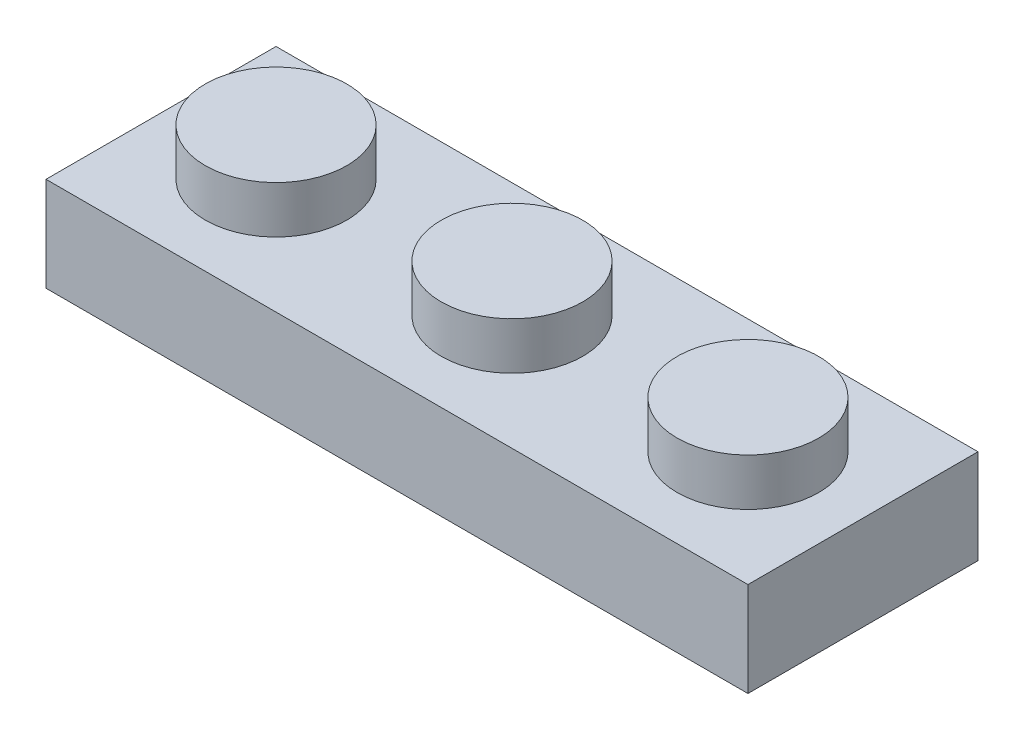
ISO-10303-21;
HEADER;
FILE_DESCRIPTION(('STEP AP214'),'2;1');
FILE_NAME('part.step','',(''),(''),'','','');
FILE_SCHEMA(('AUTOMOTIVE_DESIGN { 1 0 10303 214 1 1 1 1 }'));
ENDSEC;
DATA;
#1=APPLICATION_CONTEXT('core data for automotive mechanical design processes');
#2=APPLICATION_PROTOCOL_DEFINITION('international standard','automotive_design',2000,#1);
#3=PRODUCT_CONTEXT('',#1,'mechanical');
#4=PRODUCT('Part','Part','',(#3));
#5=PRODUCT_RELATED_PRODUCT_CATEGORY('part','',(#4));
#6=PRODUCT_DEFINITION_FORMATION('','',#4);
#7=PRODUCT_DEFINITION_CONTEXT('part definition',#1,'design');
#8=PRODUCT_DEFINITION('design','',#6,#7);
#9=PRODUCT_DEFINITION_SHAPE('','',#8);
#10=(LENGTH_UNIT() NAMED_UNIT(*) SI_UNIT(.MILLI.,.METRE.));
#11=(NAMED_UNIT(*) PLANE_ANGLE_UNIT() SI_UNIT($,.RADIAN.));
#12=(NAMED_UNIT(*) SI_UNIT($,.STERADIAN.) SOLID_ANGLE_UNIT());
#13=UNCERTAINTY_MEASURE_WITH_UNIT(LENGTH_MEASURE(1.E-05),#10,'distance_accuracy_value','');
#14=(GEOMETRIC_REPRESENTATION_CONTEXT(3) GLOBAL_UNCERTAINTY_ASSIGNED_CONTEXT((#13)) GLOBAL_UNIT_ASSIGNED_CONTEXT((#10,
#11,#12)) REPRESENTATION_CONTEXT('',''));
#15=CARTESIAN_POINT('',(0.,0.,0.));
#16=DIRECTION('',(0.,0.,1.));
#17=DIRECTION('',(1.,0.,0.));
#18=AXIS2_PLACEMENT_3D('',#15,#16,#17);
#19=CARTESIAN_POINT('',(0.,0.,-7.8));
#20=DIRECTION('',(0.,-1.,0.));
#21=DIRECTION('',(0.,0.,-1.));
#22=AXIS2_PLACEMENT_3D('',#19,#20,#21);
#23=PLANE('',#22);
#24=DIRECTION('',(1.,0.,0.));
#25=VECTOR('',#24,1.);
#26=CARTESIAN_POINT('',(0.,0.,0.));
#27=LINE('',#26,#25);
#28=CARTESIAN_POINT('',(0.,0.,0.));
#29=VERTEX_POINT('',#28);
#30=CARTESIAN_POINT('',(23.8,0.,0.));
#31=VERTEX_POINT('',#30);
#32=EDGE_CURVE('E213',#29,#31,#27,.T.);
#33=ORIENTED_EDGE('',*,*,#32,.F.);
#34=DIRECTION('',(0.,0.,1.));
#35=VECTOR('',#34,1.);
#36=CARTESIAN_POINT('',(0.,0.,-7.8));
#37=LINE('',#36,#35);
#38=CARTESIAN_POINT('',(0.,0.,-7.8));
#39=VERTEX_POINT('',#38);
#40=EDGE_CURVE('E92',#39,#29,#37,.T.);
#41=ORIENTED_EDGE('',*,*,#40,.F.);
#42=DIRECTION('',(1.,0.,0.));
#43=VECTOR('',#42,1.);
#44=CARTESIAN_POINT('',(0.,0.,-7.8));
#45=LINE('',#44,#43);
#46=CARTESIAN_POINT('',(23.8,0.,-7.8));
#47=VERTEX_POINT('',#46);
#48=EDGE_CURVE('E199',#39,#47,#45,.T.);
#49=ORIENTED_EDGE('',*,*,#48,.T.);
#50=DIRECTION('',(0.,0.,1.));
#51=VECTOR('',#50,1.);
#52=CARTESIAN_POINT('',(23.8,0.,-7.8));
#53=LINE('',#52,#51);
#54=EDGE_CURVE('E230',#47,#31,#53,.T.);
#55=ORIENTED_EDGE('',*,*,#54,.T.);
#56=EDGE_LOOP('',(#33,#41,#49,#55));
#57=FACE_BOUND('',#56,.T.);
#58=DIRECTION('',(0.,0.,1.));
#59=VECTOR('',#58,1.);
#60=CARTESIAN_POINT('',(1.2,0.,-7.8));
#61=LINE('',#60,#59);
#62=CARTESIAN_POINT('',(1.2,0.,-6.6));
#63=VERTEX_POINT('',#62);
#64=CARTESIAN_POINT('',(1.2,0.,-1.2));
#65=VERTEX_POINT('',#64);
#66=EDGE_CURVE('E140',#63,#65,#61,.T.);
#67=ORIENTED_EDGE('',*,*,#66,.T.);
#68=DIRECTION('',(1.,0.,0.));
#69=VECTOR('',#68,1.);
#70=CARTESIAN_POINT('',(0.,0.,-1.2));
#71=LINE('',#70,#69);
#72=CARTESIAN_POINT('',(22.6,0.,-1.2));
#73=VERTEX_POINT('',#72);
#74=EDGE_CURVE('E154',#65,#73,#71,.T.);
#75=ORIENTED_EDGE('',*,*,#74,.T.);
#76=DIRECTION('',(0.,0.,1.));
#77=VECTOR('',#76,1.);
#78=CARTESIAN_POINT('',(22.6,0.,-7.8));
#79=LINE('',#78,#77);
#80=CARTESIAN_POINT('',(22.6,0.,-6.6));
#81=VERTEX_POINT('',#80);
#82=EDGE_CURVE('E129',#81,#73,#79,.T.);
#83=ORIENTED_EDGE('',*,*,#82,.F.);
#84=DIRECTION('',(1.,0.,0.));
#85=VECTOR('',#84,1.);
#86=CARTESIAN_POINT('',(0.,0.,-6.6));
#87=LINE('',#86,#85);
#88=EDGE_CURVE('E57',#63,#81,#87,.T.);
#89=ORIENTED_EDGE('',*,*,#88,.F.);
#90=EDGE_LOOP('',(#67,#75,#83,#89));
#91=FACE_BOUND('',#90,.T.);
#92=ADVANCED_FACE('F41',(#57,#91),#23,.T.);
#93=CARTESIAN_POINT('',(19.9,4.8,-3.9));
#94=DIRECTION('',(0.,1.,0.));
#95=DIRECTION('',(0.,0.,1.));
#96=AXIS2_PLACEMENT_3D('',#93,#94,#95);
#97=PLANE('',#96);
#98=CARTESIAN_POINT('',(19.9,4.8,-3.9));
#99=DIRECTION('',(0.,1.,0.));
#100=DIRECTION('',(0.,0.,1.));
#101=AXIS2_PLACEMENT_3D('',#98,#99,#100);
#102=CIRCLE('',#101,2.4);
#103=CARTESIAN_POINT('',(19.9,4.8,-1.5));
#104=VERTEX_POINT('',#103);
#105=EDGE_CURVE('E238',#104,#104,#102,.T.);
#106=ORIENTED_EDGE('',*,*,#105,.T.);
#107=EDGE_LOOP('',(#106));
#108=FACE_BOUND('',#107,.T.);
#109=ADVANCED_FACE('F43',(#108),#97,.T.);
#110=CARTESIAN_POINT('',(19.9,4.8,-3.9));
#111=DIRECTION('',(0.,-1.,0.));
#112=DIRECTION('',(0.,0.,-1.));
#113=AXIS2_PLACEMENT_3D('',#110,#111,#112);
#114=CYLINDRICAL_SURFACE('',#113,2.4);
#115=ORIENTED_EDGE('',*,*,#105,.F.);
#116=EDGE_LOOP('',(#115));
#117=FACE_BOUND('',#116,.T.);
#118=CARTESIAN_POINT('',(19.9,3.2,-3.9));
#119=DIRECTION('',(0.,1.,0.));
#120=DIRECTION('',(0.,0.,1.));
#121=AXIS2_PLACEMENT_3D('',#118,#119,#120);
#122=CIRCLE('',#121,2.4);
#123=CARTESIAN_POINT('',(19.9,3.2,-1.5));
#124=VERTEX_POINT('',#123);
#125=EDGE_CURVE('E226',#124,#124,#122,.T.);
#126=ORIENTED_EDGE('',*,*,#125,.T.);
#127=EDGE_LOOP('',(#126));
#128=FACE_BOUND('',#127,.T.);
#129=ADVANCED_FACE('F276',(#117,#128),#114,.T.);
#130=CARTESIAN_POINT('',(0.,0.,-7.8));
#131=DIRECTION('',(-1.,0.,0.));
#132=DIRECTION('',(0.,0.,1.));
#133=AXIS2_PLACEMENT_3D('',#130,#131,#132);
#134=PLANE('',#133);
#135=DIRECTION('',(0.,-1.,0.));
#136=VECTOR('',#135,1.);
#137=CARTESIAN_POINT('',(0.,0.,0.));
#138=LINE('',#137,#136);
#139=CARTESIAN_POINT('',(0.,3.2,0.));
#140=VERTEX_POINT('',#139);
#141=EDGE_CURVE('E192',#140,#29,#138,.T.);
#142=ORIENTED_EDGE('',*,*,#141,.F.);
#143=DIRECTION('',(0.,0.,1.));
#144=VECTOR('',#143,1.);
#145=CARTESIAN_POINT('',(0.,3.2,-7.8));
#146=LINE('',#145,#144);
#147=CARTESIAN_POINT('',(0.,3.2,-7.8));
#148=VERTEX_POINT('',#147);
#149=EDGE_CURVE('E66',#148,#140,#146,.T.);
#150=ORIENTED_EDGE('',*,*,#149,.F.);
#151=DIRECTION('',(0.,-1.,0.));
#152=VECTOR('',#151,1.);
#153=CARTESIAN_POINT('',(0.,0.,-7.8));
#154=LINE('',#153,#152);
#155=EDGE_CURVE('E196',#148,#39,#154,.T.);
#156=ORIENTED_EDGE('',*,*,#155,.T.);
#157=ORIENTED_EDGE('',*,*,#40,.T.);
#158=EDGE_LOOP('',(#142,#150,#156,#157));
#159=FACE_BOUND('',#158,.T.);
#160=ADVANCED_FACE('F282',(#159),#134,.T.);
#161=CARTESIAN_POINT('',(0.,3.2,-7.8));
#162=DIRECTION('',(0.,1.,0.));
#163=DIRECTION('',(0.,0.,1.));
#164=AXIS2_PLACEMENT_3D('',#161,#162,#163);
#165=PLANE('',#164);
#166=CARTESIAN_POINT('',(11.9,3.2,-3.9));
#167=DIRECTION('',(0.,1.,0.));
#168=DIRECTION('',(0.,0.,1.));
#169=AXIS2_PLACEMENT_3D('',#166,#167,#168);
#170=CIRCLE('',#169,2.4);
#171=CARTESIAN_POINT('',(11.9,3.2,-1.5));
#172=VERTEX_POINT('',#171);
#173=EDGE_CURVE('E178',#172,#172,#170,.T.);
#174=ORIENTED_EDGE('',*,*,#173,.F.);
#175=EDGE_LOOP('',(#174));
#176=FACE_BOUND('',#175,.T.);
#177=CARTESIAN_POINT('',(3.9,3.2,-3.9));
#178=DIRECTION('',(0.,1.,0.));
#179=DIRECTION('',(0.,0.,1.));
#180=AXIS2_PLACEMENT_3D('',#177,#178,#179);
#181=CIRCLE('',#180,2.4);
#182=CARTESIAN_POINT('',(3.9,3.2,-1.5));
#183=VERTEX_POINT('',#182);
#184=EDGE_CURVE('E187',#183,#183,#181,.T.);
#185=ORIENTED_EDGE('',*,*,#184,.F.);
#186=EDGE_LOOP('',(#185));
#187=FACE_BOUND('',#186,.T.);
#188=DIRECTION('',(-1.,0.,0.));
#189=VECTOR('',#188,1.);
#190=CARTESIAN_POINT('',(0.,3.2,0.));
#191=LINE('',#190,#189);
#192=CARTESIAN_POINT('',(23.8,3.2,0.));
#193=VERTEX_POINT('',#192);
#194=EDGE_CURVE('E200',#193,#140,#191,.T.);
#195=ORIENTED_EDGE('',*,*,#194,.F.);
#196=DIRECTION('',(0.,0.,1.));
#197=VECTOR('',#196,1.);
#198=CARTESIAN_POINT('',(23.8,3.2,-7.8));
#199=LINE('',#198,#197);
#200=CARTESIAN_POINT('',(23.8,3.2,-7.8));
#201=VERTEX_POINT('',#200);
#202=EDGE_CURVE('E227',#201,#193,#199,.T.);
#203=ORIENTED_EDGE('',*,*,#202,.F.);
#204=DIRECTION('',(-1.,0.,0.));
#205=VECTOR('',#204,1.);
#206=CARTESIAN_POINT('',(0.,3.2,-7.8));
#207=LINE('',#206,#205);
#208=EDGE_CURVE('E207',#201,#148,#207,.T.);
#209=ORIENTED_EDGE('',*,*,#208,.T.);
#210=ORIENTED_EDGE('',*,*,#149,.T.);
#211=EDGE_LOOP('',(#195,#203,#209,#210));
#212=FACE_BOUND('',#211,.T.);
#213=ORIENTED_EDGE('',*,*,#125,.F.);
#214=EDGE_LOOP('',(#213));
#215=FACE_BOUND('',#214,.T.);
#216=ADVANCED_FACE('F284',(#176,#187,#212,#215),#165,.T.);
#217=CARTESIAN_POINT('',(23.8,0.,-7.8));
#218=DIRECTION('',(1.,0.,0.));
#219=DIRECTION('',(0.,0.,-1.));
#220=AXIS2_PLACEMENT_3D('',#217,#218,#219);
#221=PLANE('',#220);
#222=DIRECTION('',(0.,1.,0.));
#223=VECTOR('',#222,1.);
#224=CARTESIAN_POINT('',(23.8,0.,0.));
#225=LINE('',#224,#223);
#226=EDGE_CURVE('E217',#31,#193,#225,.T.);
#227=ORIENTED_EDGE('',*,*,#226,.F.);
#228=ORIENTED_EDGE('',*,*,#54,.F.);
#229=DIRECTION('',(0.,1.,0.));
#230=VECTOR('',#229,1.);
#231=CARTESIAN_POINT('',(23.8,0.,-7.8));
#232=LINE('',#231,#230);
#233=EDGE_CURVE('E203',#47,#201,#232,.T.);
#234=ORIENTED_EDGE('',*,*,#233,.T.);
#235=ORIENTED_EDGE('',*,*,#202,.T.);
#236=EDGE_LOOP('',(#227,#228,#234,#235));
#237=FACE_BOUND('',#236,.T.);
#238=ADVANCED_FACE('F280',(#237),#221,.T.);
#239=CARTESIAN_POINT('',(0.,0.,-7.8));
#240=DIRECTION('',(0.,0.,-1.));
#241=DIRECTION('',(-1.,0.,0.));
#242=AXIS2_PLACEMENT_3D('',#239,#240,#241);
#243=PLANE('',#242);
#244=ORIENTED_EDGE('',*,*,#155,.F.);
#245=ORIENTED_EDGE('',*,*,#208,.F.);
#246=ORIENTED_EDGE('',*,*,#233,.F.);
#247=ORIENTED_EDGE('',*,*,#48,.F.);
#248=EDGE_LOOP('',(#244,#245,#246,#247));
#249=FACE_BOUND('',#248,.T.);
#250=ADVANCED_FACE('F298',(#249),#243,.T.);
#251=CARTESIAN_POINT('',(0.,0.,0.));
#252=DIRECTION('',(0.,0.,-1.));
#253=DIRECTION('',(-1.,0.,0.));
#254=AXIS2_PLACEMENT_3D('',#251,#252,#253);
#255=PLANE('',#254);
#256=ORIENTED_EDGE('',*,*,#141,.T.);
#257=ORIENTED_EDGE('',*,*,#32,.T.);
#258=ORIENTED_EDGE('',*,*,#226,.T.);
#259=ORIENTED_EDGE('',*,*,#194,.T.);
#260=EDGE_LOOP('',(#256,#257,#258,#259));
#261=FACE_BOUND('',#260,.T.);
#262=ADVANCED_FACE('F303',(#261),#255,.F.);
#263=CARTESIAN_POINT('',(3.9,4.8,-3.9));
#264=DIRECTION('',(0.,-1.,0.));
#265=DIRECTION('',(0.,0.,-1.));
#266=AXIS2_PLACEMENT_3D('',#263,#264,#265);
#267=CYLINDRICAL_SURFACE('',#266,2.4);
#268=CARTESIAN_POINT('',(3.9,4.8,-3.9));
#269=DIRECTION('',(0.,1.,0.));
#270=DIRECTION('',(0.,0.,1.));
#271=AXIS2_PLACEMENT_3D('',#268,#269,#270);
#272=CIRCLE('',#271,2.4);
#273=CARTESIAN_POINT('',(3.9,4.8,-1.5));
#274=VERTEX_POINT('',#273);
#275=EDGE_CURVE('E188',#274,#274,#272,.T.);
#276=ORIENTED_EDGE('',*,*,#275,.F.);
#277=EDGE_LOOP('',(#276));
#278=FACE_BOUND('',#277,.T.);
#279=ORIENTED_EDGE('',*,*,#184,.T.);
#280=EDGE_LOOP('',(#279));
#281=FACE_BOUND('',#280,.T.);
#282=ADVANCED_FACE('F306',(#278,#281),#267,.T.);
#283=CARTESIAN_POINT('',(3.9,4.8,-3.9));
#284=DIRECTION('',(0.,1.,0.));
#285=DIRECTION('',(0.,0.,1.));
#286=AXIS2_PLACEMENT_3D('',#283,#284,#285);
#287=PLANE('',#286);
#288=ORIENTED_EDGE('',*,*,#275,.T.);
#289=EDGE_LOOP('',(#288));
#290=FACE_BOUND('',#289,.T.);
#291=ADVANCED_FACE('F313',(#290),#287,.T.);
#292=CARTESIAN_POINT('',(11.9,4.8,-3.9));
#293=DIRECTION('',(0.,-1.,0.));
#294=DIRECTION('',(0.,0.,-1.));
#295=AXIS2_PLACEMENT_3D('',#292,#293,#294);
#296=CYLINDRICAL_SURFACE('',#295,2.4);
#297=CARTESIAN_POINT('',(11.9,4.8,-3.9));
#298=DIRECTION('',(0.,1.,0.));
#299=DIRECTION('',(0.,0.,1.));
#300=AXIS2_PLACEMENT_3D('',#297,#298,#299);
#301=CIRCLE('',#300,2.4);
#302=CARTESIAN_POINT('',(11.9,4.8,-1.5));
#303=VERTEX_POINT('',#302);
#304=EDGE_CURVE('E182',#303,#303,#301,.T.);
#305=ORIENTED_EDGE('',*,*,#304,.F.);
#306=EDGE_LOOP('',(#305));
#307=FACE_BOUND('',#306,.T.);
#308=ORIENTED_EDGE('',*,*,#173,.T.);
#309=EDGE_LOOP('',(#308));
#310=FACE_BOUND('',#309,.T.);
#311=ADVANCED_FACE('F317',(#307,#310),#296,.T.);
#312=CARTESIAN_POINT('',(11.9,4.8,-3.9));
#313=DIRECTION('',(0.,1.,0.));
#314=DIRECTION('',(0.,0.,1.));
#315=AXIS2_PLACEMENT_3D('',#312,#313,#314);
#316=PLANE('',#315);
#317=ORIENTED_EDGE('',*,*,#304,.T.);
#318=EDGE_LOOP('',(#317));
#319=FACE_BOUND('',#318,.T.);
#320=ADVANCED_FACE('F321',(#319),#316,.T.);
#321=CARTESIAN_POINT('',(19.9,3.6,-3.9));
#322=DIRECTION('',(0.,1.,0.));
#323=DIRECTION('',(0.,0.,1.));
#324=AXIS2_PLACEMENT_3D('',#321,#322,#323);
#325=PLANE('',#324);
#326=CARTESIAN_POINT('',(19.9,3.6,-3.9));
#327=DIRECTION('',(0.,1.,0.));
#328=DIRECTION('',(0.,0.,1.));
#329=AXIS2_PLACEMENT_3D('',#326,#327,#328);
#330=CIRCLE('',#329,1.2);
#331=CARTESIAN_POINT('',(19.9,3.6,-2.7));
#332=VERTEX_POINT('',#331);
#333=EDGE_CURVE('E183',#332,#332,#330,.T.);
#334=ORIENTED_EDGE('',*,*,#333,.F.);
#335=EDGE_LOOP('',(#334));
#336=FACE_BOUND('',#335,.T.);
#337=ADVANCED_FACE('F325',(#336),#325,.F.);
#338=CARTESIAN_POINT('',(19.9,4.8,-3.9));
#339=DIRECTION('',(0.,-1.,0.));
#340=DIRECTION('',(0.,0.,-1.));
#341=AXIS2_PLACEMENT_3D('',#338,#339,#340);
#342=CYLINDRICAL_SURFACE('',#341,1.2);
#343=ORIENTED_EDGE('',*,*,#333,.T.);
#344=EDGE_LOOP('',(#343));
#345=FACE_BOUND('',#344,.T.);
#346=CARTESIAN_POINT('',(19.9,2.,-3.9));
#347=DIRECTION('',(0.,1.,0.));
#348=DIRECTION('',(0.,0.,1.));
#349=AXIS2_PLACEMENT_3D('',#346,#347,#348);
#350=CIRCLE('',#349,1.2);
#351=CARTESIAN_POINT('',(19.9,2.,-2.7));
#352=VERTEX_POINT('',#351);
#353=EDGE_CURVE('E149',#352,#352,#350,.T.);
#354=ORIENTED_EDGE('',*,*,#353,.F.);
#355=EDGE_LOOP('',(#354));
#356=FACE_BOUND('',#355,.T.);
#357=ADVANCED_FACE('F351',(#345,#356),#342,.F.);
#358=CARTESIAN_POINT('',(1.2,0.,-7.8));
#359=DIRECTION('',(-1.,0.,0.));
#360=DIRECTION('',(0.,0.,1.));
#361=AXIS2_PLACEMENT_3D('',#358,#359,#360);
#362=PLANE('',#361);
#363=DIRECTION('',(0.,-1.,0.));
#364=VECTOR('',#363,1.);
#365=CARTESIAN_POINT('',(1.2,0.,-1.2));
#366=LINE('',#365,#364);
#367=CARTESIAN_POINT('',(1.2,2.,-1.2));
#368=VERTEX_POINT('',#367);
#369=EDGE_CURVE('E150',#368,#65,#366,.T.);
#370=ORIENTED_EDGE('',*,*,#369,.T.);
#371=ORIENTED_EDGE('',*,*,#66,.F.);
#372=DIRECTION('',(0.,-1.,0.));
#373=VECTOR('',#372,1.);
#374=CARTESIAN_POINT('',(1.2,0.,-6.6));
#375=LINE('',#374,#373);
#376=CARTESIAN_POINT('',(1.2,2.,-6.6));
#377=VERTEX_POINT('',#376);
#378=EDGE_CURVE('E156',#377,#63,#375,.T.);
#379=ORIENTED_EDGE('',*,*,#378,.F.);
#380=DIRECTION('',(0.,0.,1.));
#381=VECTOR('',#380,1.);
#382=CARTESIAN_POINT('',(1.2,2.,-7.8));
#383=LINE('',#382,#381);
#384=EDGE_CURVE('E128',#377,#368,#383,.T.);
#385=ORIENTED_EDGE('',*,*,#384,.T.);
#386=EDGE_LOOP('',(#370,#371,#379,#385));
#387=FACE_BOUND('',#386,.T.);
#388=ADVANCED_FACE('F250',(#387),#362,.F.);
#389=CARTESIAN_POINT('',(0.,2.,-7.8));
#390=DIRECTION('',(0.,1.,0.));
#391=DIRECTION('',(0.,0.,1.));
#392=AXIS2_PLACEMENT_3D('',#389,#390,#391);
#393=PLANE('',#392);
#394=CARTESIAN_POINT('',(15.9,2.,-3.9));
#395=DIRECTION('',(0.,1.,0.));
#396=DIRECTION('',(0.,0.,1.));
#397=AXIS2_PLACEMENT_3D('',#394,#395,#396);
#398=CIRCLE('',#397,1.5);
#399=CARTESIAN_POINT('',(15.9,2.,-2.4));
#400=VERTEX_POINT('',#399);
#401=EDGE_CURVE('E12',#400,#400,#398,.F.);
#402=ORIENTED_EDGE('',*,*,#401,.F.);
#403=EDGE_LOOP('',(#402));
#404=FACE_BOUND('',#403,.T.);
#405=CARTESIAN_POINT('',(7.9,2.,-3.9));
#406=DIRECTION('',(0.,1.,0.));
#407=DIRECTION('',(0.,0.,1.));
#408=AXIS2_PLACEMENT_3D('',#405,#406,#407);
#409=CIRCLE('',#408,1.5);
#410=CARTESIAN_POINT('',(7.9,2.,-2.4));
#411=VERTEX_POINT('',#410);
#412=EDGE_CURVE('E50',#411,#411,#409,.F.);
#413=ORIENTED_EDGE('',*,*,#412,.F.);
#414=EDGE_LOOP('',(#413));
#415=FACE_BOUND('',#414,.T.);
#416=CARTESIAN_POINT('',(11.9,2.,-3.9));
#417=DIRECTION('',(0.,1.,0.));
#418=DIRECTION('',(0.,0.,1.));
#419=AXIS2_PLACEMENT_3D('',#416,#417,#418);
#420=CIRCLE('',#419,1.2);
#421=CARTESIAN_POINT('',(11.9,2.,-2.7));
#422=VERTEX_POINT('',#421);
#423=EDGE_CURVE('E169',#422,#422,#420,.T.);
#424=ORIENTED_EDGE('',*,*,#423,.T.);
#425=EDGE_LOOP('',(#424));
#426=FACE_BOUND('',#425,.T.);
#427=CARTESIAN_POINT('',(3.9,2.,-3.9));
#428=DIRECTION('',(0.,1.,0.));
#429=DIRECTION('',(0.,0.,1.));
#430=AXIS2_PLACEMENT_3D('',#427,#428,#429);
#431=CIRCLE('',#430,1.2);
#432=CARTESIAN_POINT('',(3.9,2.,-2.7));
#433=VERTEX_POINT('',#432);
#434=EDGE_CURVE('E165',#433,#433,#431,.T.);
#435=ORIENTED_EDGE('',*,*,#434,.T.);
#436=EDGE_LOOP('',(#435));
#437=FACE_BOUND('',#436,.T.);
#438=DIRECTION('',(-1.,0.,0.));
#439=VECTOR('',#438,1.);
#440=CARTESIAN_POINT('',(0.,2.,-1.2));
#441=LINE('',#440,#439);
#442=CARTESIAN_POINT('',(22.6,2.,-1.2));
#443=VERTEX_POINT('',#442);
#444=EDGE_CURVE('E158',#443,#368,#441,.T.);
#445=ORIENTED_EDGE('',*,*,#444,.T.);
#446=ORIENTED_EDGE('',*,*,#384,.F.);
#447=DIRECTION('',(-1.,0.,0.));
#448=VECTOR('',#447,1.);
#449=CARTESIAN_POINT('',(0.,2.,-6.6));
#450=LINE('',#449,#448);
#451=CARTESIAN_POINT('',(22.6,2.,-6.6));
#452=VERTEX_POINT('',#451);
#453=EDGE_CURVE('E133',#452,#377,#450,.T.);
#454=ORIENTED_EDGE('',*,*,#453,.F.);
#455=DIRECTION('',(0.,0.,1.));
#456=VECTOR('',#455,1.);
#457=CARTESIAN_POINT('',(22.6,2.,-7.8));
#458=LINE('',#457,#456);
#459=EDGE_CURVE('E117',#452,#443,#458,.T.);
#460=ORIENTED_EDGE('',*,*,#459,.T.);
#461=EDGE_LOOP('',(#445,#446,#454,#460));
#462=FACE_BOUND('',#461,.T.);
#463=ORIENTED_EDGE('',*,*,#353,.T.);
#464=EDGE_LOOP('',(#463));
#465=FACE_BOUND('',#464,.T.);
#466=ADVANCED_FACE('F136',(#404,#415,#426,#437,#462,#465),#393,.F.);
#467=CARTESIAN_POINT('',(22.6,0.,-7.8));
#468=DIRECTION('',(1.,0.,0.));
#469=DIRECTION('',(0.,0.,-1.));
#470=AXIS2_PLACEMENT_3D('',#467,#468,#469);
#471=PLANE('',#470);
#472=DIRECTION('',(0.,1.,0.));
#473=VECTOR('',#472,1.);
#474=CARTESIAN_POINT('',(22.6,0.,-1.2));
#475=LINE('',#474,#473);
#476=EDGE_CURVE('E122',#73,#443,#475,.T.);
#477=ORIENTED_EDGE('',*,*,#476,.T.);
#478=ORIENTED_EDGE('',*,*,#459,.F.);
#479=DIRECTION('',(0.,1.,0.));
#480=VECTOR('',#479,1.);
#481=CARTESIAN_POINT('',(22.6,0.,-6.6));
#482=LINE('',#481,#480);
#483=EDGE_CURVE('E119',#81,#452,#482,.T.);
#484=ORIENTED_EDGE('',*,*,#483,.F.);
#485=ORIENTED_EDGE('',*,*,#82,.T.);
#486=EDGE_LOOP('',(#477,#478,#484,#485));
#487=FACE_BOUND('',#486,.T.);
#488=ADVANCED_FACE('F118',(#487),#471,.F.);
#489=CARTESIAN_POINT('',(0.,0.,-6.6));
#490=DIRECTION('',(0.,0.,-1.));
#491=DIRECTION('',(-1.,0.,0.));
#492=AXIS2_PLACEMENT_3D('',#489,#490,#491);
#493=PLANE('',#492);
#494=ORIENTED_EDGE('',*,*,#378,.T.);
#495=ORIENTED_EDGE('',*,*,#88,.T.);
#496=ORIENTED_EDGE('',*,*,#483,.T.);
#497=ORIENTED_EDGE('',*,*,#453,.T.);
#498=EDGE_LOOP('',(#494,#495,#496,#497));
#499=FACE_BOUND('',#498,.T.);
#500=ADVANCED_FACE('F132',(#499),#493,.F.);
#501=CARTESIAN_POINT('',(0.,0.,-1.2));
#502=DIRECTION('',(0.,0.,-1.));
#503=DIRECTION('',(-1.,0.,0.));
#504=AXIS2_PLACEMENT_3D('',#501,#502,#503);
#505=PLANE('',#504);
#506=ORIENTED_EDGE('',*,*,#369,.F.);
#507=ORIENTED_EDGE('',*,*,#444,.F.);
#508=ORIENTED_EDGE('',*,*,#476,.F.);
#509=ORIENTED_EDGE('',*,*,#74,.F.);
#510=EDGE_LOOP('',(#506,#507,#508,#509));
#511=FACE_BOUND('',#510,.T.);
#512=ADVANCED_FACE('F268',(#511),#505,.T.);
#513=CARTESIAN_POINT('',(3.9,4.8,-3.9));
#514=DIRECTION('',(0.,-1.,0.));
#515=DIRECTION('',(0.,0.,-1.));
#516=AXIS2_PLACEMENT_3D('',#513,#514,#515);
#517=CYLINDRICAL_SURFACE('',#516,1.2);
#518=CARTESIAN_POINT('',(3.9,3.6,-3.9));
#519=DIRECTION('',(0.,1.,0.));
#520=DIRECTION('',(0.,0.,1.));
#521=AXIS2_PLACEMENT_3D('',#518,#519,#520);
#522=CIRCLE('',#521,1.2);
#523=CARTESIAN_POINT('',(3.9,3.6,-2.7));
#524=VERTEX_POINT('',#523);
#525=EDGE_CURVE('E155',#524,#524,#522,.T.);
#526=ORIENTED_EDGE('',*,*,#525,.T.);
#527=EDGE_LOOP('',(#526));
#528=FACE_BOUND('',#527,.T.);
#529=ORIENTED_EDGE('',*,*,#434,.F.);
#530=EDGE_LOOP('',(#529));
#531=FACE_BOUND('',#530,.T.);
#532=ADVANCED_FACE('F338',(#528,#531),#517,.F.);
#533=CARTESIAN_POINT('',(3.9,3.6,-3.9));
#534=DIRECTION('',(0.,1.,0.));
#535=DIRECTION('',(0.,0.,1.));
#536=AXIS2_PLACEMENT_3D('',#533,#534,#535);
#537=PLANE('',#536);
#538=ORIENTED_EDGE('',*,*,#525,.F.);
#539=EDGE_LOOP('',(#538));
#540=FACE_BOUND('',#539,.T.);
#541=ADVANCED_FACE('F334',(#540),#537,.F.);
#542=CARTESIAN_POINT('',(11.9,4.8,-3.9));
#543=DIRECTION('',(0.,-1.,0.));
#544=DIRECTION('',(0.,0.,-1.));
#545=AXIS2_PLACEMENT_3D('',#542,#543,#544);
#546=CYLINDRICAL_SURFACE('',#545,1.2);
#547=CARTESIAN_POINT('',(11.9,3.6,-3.9));
#548=DIRECTION('',(0.,1.,0.));
#549=DIRECTION('',(0.,0.,1.));
#550=AXIS2_PLACEMENT_3D('',#547,#548,#549);
#551=CIRCLE('',#550,1.2);
#552=CARTESIAN_POINT('',(11.9,3.6,-2.7));
#553=VERTEX_POINT('',#552);
#554=EDGE_CURVE('E166',#553,#553,#551,.T.);
#555=ORIENTED_EDGE('',*,*,#554,.T.);
#556=EDGE_LOOP('',(#555));
#557=FACE_BOUND('',#556,.T.);
#558=ORIENTED_EDGE('',*,*,#423,.F.);
#559=EDGE_LOOP('',(#558));
#560=FACE_BOUND('',#559,.T.);
#561=ADVANCED_FACE('F330',(#557,#560),#546,.F.);
#562=CARTESIAN_POINT('',(11.9,3.6,-3.9));
#563=DIRECTION('',(0.,1.,0.));
#564=DIRECTION('',(0.,0.,1.));
#565=AXIS2_PLACEMENT_3D('',#562,#563,#564);
#566=PLANE('',#565);
#567=ORIENTED_EDGE('',*,*,#554,.F.);
#568=EDGE_LOOP('',(#567));
#569=FACE_BOUND('',#568,.T.);
#570=ADVANCED_FACE('F327',(#569),#566,.F.);
#571=CARTESIAN_POINT('',(7.9,-4.24264068711929,-3.9));
#572=DIRECTION('',(0.,1.,0.));
#573=DIRECTION('',(0.,0.,1.));
#574=AXIS2_PLACEMENT_3D('',#571,#572,#573);
#575=CYLINDRICAL_SURFACE('',#574,1.5);
#576=ORIENTED_EDGE('',*,*,#412,.T.);
#577=EDGE_LOOP('',(#576));
#578=FACE_BOUND('',#577,.T.);
#579=CARTESIAN_POINT('',(7.9,0.2,-3.9));
#580=DIRECTION('',(0.,-1.,0.));
#581=DIRECTION('',(0.,0.,-1.));
#582=AXIS2_PLACEMENT_3D('',#579,#580,#581);
#583=CIRCLE('',#582,1.5);
#584=CARTESIAN_POINT('',(7.9,0.2,-5.4));
#585=VERTEX_POINT('',#584);
#586=EDGE_CURVE('E405',#585,#585,#583,.T.);
#587=ORIENTED_EDGE('',*,*,#586,.F.);
#588=EDGE_LOOP('',(#587));
#589=FACE_BOUND('',#588,.T.);
#590=ADVANCED_FACE('F245',(#578,#589),#575,.T.);
#591=CARTESIAN_POINT('',(7.9,-4.24264068711929,-3.9));
#592=DIRECTION('',(0.,1.,0.));
#593=DIRECTION('',(0.,0.,1.));
#594=AXIS2_PLACEMENT_3D('',#591,#592,#593);
#595=CYLINDRICAL_SURFACE('',#594,0.6);
#596=CARTESIAN_POINT('',(7.9,2.,-3.9));
#597=DIRECTION('',(0.,-1.,0.));
#598=DIRECTION('',(0.,0.,-1.));
#599=AXIS2_PLACEMENT_3D('',#596,#597,#598);
#600=CIRCLE('',#599,0.6);
#601=CARTESIAN_POINT('',(7.9,2.,-4.5));
#602=VERTEX_POINT('',#601);
#603=EDGE_CURVE('E398',#602,#602,#600,.T.);
#604=ORIENTED_EDGE('',*,*,#603,.F.);
#605=EDGE_LOOP('',(#604));
#606=FACE_BOUND('',#605,.T.);
#607=CARTESIAN_POINT('',(7.9,0.2,-3.9));
#608=DIRECTION('',(0.,-1.,0.));
#609=DIRECTION('',(0.,0.,-1.));
#610=AXIS2_PLACEMENT_3D('',#607,#608,#609);
#611=CIRCLE('',#610,0.6);
#612=CARTESIAN_POINT('',(7.9,0.2,-4.5));
#613=VERTEX_POINT('',#612);
#614=EDGE_CURVE('E392',#613,#613,#611,.T.);
#615=ORIENTED_EDGE('',*,*,#614,.T.);
#616=EDGE_LOOP('',(#615));
#617=FACE_BOUND('',#616,.T.);
#618=ADVANCED_FACE('F360',(#606,#617),#595,.F.);
#619=CARTESIAN_POINT('',(0.,0.2,-7.8));
#620=DIRECTION('',(0.,-1.,0.));
#621=DIRECTION('',(0.,0.,-1.));
#622=AXIS2_PLACEMENT_3D('',#619,#620,#621);
#623=PLANE('',#622);
#624=ORIENTED_EDGE('',*,*,#614,.F.);
#625=EDGE_LOOP('',(#624));
#626=FACE_BOUND('',#625,.T.);
#627=ORIENTED_EDGE('',*,*,#586,.T.);
#628=EDGE_LOOP('',(#627));
#629=FACE_BOUND('',#628,.T.);
#630=ADVANCED_FACE('F363',(#626,#629),#623,.T.);
#631=ORIENTED_EDGE('',*,*,#603,.T.);
#632=EDGE_LOOP('',(#631));
#633=FACE_BOUND('',#632,.T.);
#634=ADVANCED_FACE('F254',(#633),#393,.F.);
#635=CARTESIAN_POINT('',(15.9,-4.24264068711929,-3.9));
#636=DIRECTION('',(0.,1.,0.));
#637=DIRECTION('',(0.,0.,1.));
#638=AXIS2_PLACEMENT_3D('',#635,#636,#637);
#639=CYLINDRICAL_SURFACE('',#638,1.5);
#640=ORIENTED_EDGE('',*,*,#401,.T.);
#641=EDGE_LOOP('',(#640));
#642=FACE_BOUND('',#641,.T.);
#643=CARTESIAN_POINT('',(15.9,0.2,-3.9));
#644=DIRECTION('',(0.,-1.,0.));
#645=DIRECTION('',(0.,0.,-1.));
#646=AXIS2_PLACEMENT_3D('',#643,#644,#645);
#647=CIRCLE('',#646,1.5);
#648=CARTESIAN_POINT('',(15.9,0.2,-5.4));
#649=VERTEX_POINT('',#648);
#650=EDGE_CURVE('E389',#649,#649,#647,.T.);
#651=ORIENTED_EDGE('',*,*,#650,.F.);
#652=EDGE_LOOP('',(#651));
#653=FACE_BOUND('',#652,.T.);
#654=ADVANCED_FACE('F368',(#642,#653),#639,.T.);
#655=CARTESIAN_POINT('',(15.9,-4.24264068711929,-3.9));
#656=DIRECTION('',(0.,1.,0.));
#657=DIRECTION('',(0.,0.,1.));
#658=AXIS2_PLACEMENT_3D('',#655,#656,#657);
#659=CYLINDRICAL_SURFACE('',#658,0.6);
#660=CARTESIAN_POINT('',(15.9,2.,-3.9));
#661=DIRECTION('',(0.,-1.,0.));
#662=DIRECTION('',(0.,0.,-1.));
#663=AXIS2_PLACEMENT_3D('',#660,#661,#662);
#664=CIRCLE('',#663,0.6);
#665=CARTESIAN_POINT('',(15.9,2.,-4.5));
#666=VERTEX_POINT('',#665);
#667=EDGE_CURVE('E393',#666,#666,#664,.T.);
#668=ORIENTED_EDGE('',*,*,#667,.F.);
#669=EDGE_LOOP('',(#668));
#670=FACE_BOUND('',#669,.T.);
#671=CARTESIAN_POINT('',(15.9,0.2,-3.9));
#672=DIRECTION('',(0.,-1.,0.));
#673=DIRECTION('',(0.,0.,-1.));
#674=AXIS2_PLACEMENT_3D('',#671,#672,#673);
#675=CIRCLE('',#674,0.6);
#676=CARTESIAN_POINT('',(15.9,0.2,-4.5));
#677=VERTEX_POINT('',#676);
#678=EDGE_CURVE('E386',#677,#677,#675,.T.);
#679=ORIENTED_EDGE('',*,*,#678,.T.);
#680=EDGE_LOOP('',(#679));
#681=FACE_BOUND('',#680,.T.);
#682=ADVANCED_FACE('F371',(#670,#681),#659,.F.);
#683=CARTESIAN_POINT('',(0.,0.2,-7.8));
#684=DIRECTION('',(0.,-1.,0.));
#685=DIRECTION('',(0.,0.,-1.));
#686=AXIS2_PLACEMENT_3D('',#683,#684,#685);
#687=PLANE('',#686);
#688=ORIENTED_EDGE('',*,*,#678,.F.);
#689=EDGE_LOOP('',(#688));
#690=FACE_BOUND('',#689,.T.);
#691=ORIENTED_EDGE('',*,*,#650,.T.);
#692=EDGE_LOOP('',(#691));
#693=FACE_BOUND('',#692,.T.);
#694=ADVANCED_FACE('F375',(#690,#693),#687,.T.);
#695=ORIENTED_EDGE('',*,*,#667,.T.);
#696=EDGE_LOOP('',(#695));
#697=FACE_BOUND('',#696,.T.);
#698=ADVANCED_FACE('F253',(#697),#393,.F.);
#699=CLOSED_SHELL('',(#92,#109,#129,#160,#216,#238,#250,#262,#282,#291,#311,#320,#337,#357,#388,
#466,#488,#500,#512,#532,#541,#561,#570,#590,#618,#630,#634,#654,#682,#694,#698));
#700=MANIFOLD_SOLID_BREP('B2',#699);
#701=ADVANCED_BREP_SHAPE_REPRESENTATION('',(#18,#700),#14);
#702=SHAPE_DEFINITION_REPRESENTATION(#9,#701);
ENDSEC;
END-ISO-10303-21;
